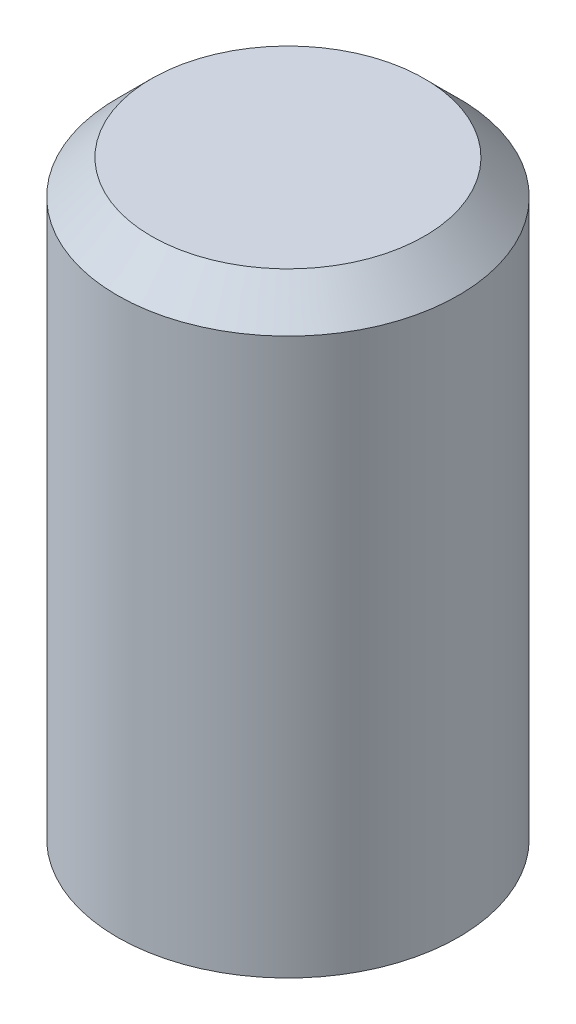
ISO-10303-21;
HEADER;
FILE_DESCRIPTION(('STEP AP214'),'2;1');
FILE_NAME('part.step','',(''),(''),'','','');
FILE_SCHEMA(('AUTOMOTIVE_DESIGN { 1 0 10303 214 1 1 1 1 }'));
ENDSEC;
DATA;
#1=APPLICATION_CONTEXT('core data for automotive mechanical design processes');
#2=APPLICATION_PROTOCOL_DEFINITION('international standard','automotive_design',2000,#1);
#3=PRODUCT_CONTEXT('',#1,'mechanical');
#4=PRODUCT('Part','Part','',(#3));
#5=PRODUCT_RELATED_PRODUCT_CATEGORY('part','',(#4));
#6=PRODUCT_DEFINITION_FORMATION('','',#4);
#7=PRODUCT_DEFINITION_CONTEXT('part definition',#1,'design');
#8=PRODUCT_DEFINITION('design','',#6,#7);
#9=PRODUCT_DEFINITION_SHAPE('','',#8);
#10=(LENGTH_UNIT() NAMED_UNIT(*) SI_UNIT(.MILLI.,.METRE.));
#11=(NAMED_UNIT(*) PLANE_ANGLE_UNIT() SI_UNIT($,.RADIAN.));
#12=(NAMED_UNIT(*) SI_UNIT($,.STERADIAN.) SOLID_ANGLE_UNIT());
#13=UNCERTAINTY_MEASURE_WITH_UNIT(LENGTH_MEASURE(1.E-05),#10,'distance_accuracy_value','');
#14=(GEOMETRIC_REPRESENTATION_CONTEXT(3) GLOBAL_UNCERTAINTY_ASSIGNED_CONTEXT((#13)) GLOBAL_UNIT_ASSIGNED_CONTEXT((#10,
#11,#12)) REPRESENTATION_CONTEXT('',''));
#15=CARTESIAN_POINT('',(0.,0.,0.));
#16=DIRECTION('',(0.,0.,1.));
#17=DIRECTION('',(1.,0.,0.));
#18=AXIS2_PLACEMENT_3D('',#15,#16,#17);
#19=CARTESIAN_POINT('',(0.,-70.,0.));
#20=DIRECTION('',(0.,1.,0.));
#21=DIRECTION('',(0.,0.,1.));
#22=AXIS2_PLACEMENT_3D('',#19,#20,#21);
#23=CYLINDRICAL_SURFACE('',#22,107.);
#24=CARTESIAN_POINT('',(0.,278.6,0.));
#25=DIRECTION('',(0.,1.,0.));
#26=DIRECTION('',(0.,0.,1.));
#27=AXIS2_PLACEMENT_3D('',#24,#25,#26);
#28=CIRCLE('',#27,107.);
#29=CARTESIAN_POINT('',(0.,278.6,107.));
#30=VERTEX_POINT('',#29);
#31=EDGE_CURVE('E10',#30,#30,#28,.F.);
#32=ORIENTED_EDGE('',*,*,#31,.T.);
#33=EDGE_LOOP('',(#32));
#34=FACE_BOUND('',#33,.T.);
#35=CARTESIAN_POINT('',(0.,-70.,0.));
#36=DIRECTION('',(0.,1.,0.));
#37=DIRECTION('',(0.,0.,1.));
#38=AXIS2_PLACEMENT_3D('',#35,#36,#37);
#39=CIRCLE('',#38,107.);
#40=CARTESIAN_POINT('',(0.,-70.,107.));
#41=VERTEX_POINT('',#40);
#42=EDGE_CURVE('E41',#41,#41,#39,.T.);
#43=ORIENTED_EDGE('',*,*,#42,.T.);
#44=EDGE_LOOP('',(#43));
#45=FACE_BOUND('',#44,.T.);
#46=ADVANCED_FACE('F30',(#34,#45),#23,.T.);
#47=CARTESIAN_POINT('',(0.,-70.,0.));
#48=DIRECTION('',(0.,1.,0.));
#49=DIRECTION('',(0.,0.,1.));
#50=AXIS2_PLACEMENT_3D('',#47,#48,#49);
#51=PLANE('',#50);
#52=ORIENTED_EDGE('',*,*,#42,.F.);
#53=EDGE_LOOP('',(#52));
#54=FACE_BOUND('',#53,.T.);
#55=ADVANCED_FACE('F49',(#54),#51,.F.);
#56=CARTESIAN_POINT('',(0.,300.,0.));
#57=DIRECTION('',(0.,1.,0.));
#58=DIRECTION('',(0.,0.,1.));
#59=AXIS2_PLACEMENT_3D('',#56,#57,#58);
#60=PLANE('',#59);
#61=CARTESIAN_POINT('',(0.,300.,0.));
#62=DIRECTION('',(0.,1.,0.));
#63=DIRECTION('',(0.,0.,1.));
#64=AXIS2_PLACEMENT_3D('',#61,#62,#63);
#65=CIRCLE('',#64,85.6);
#66=CARTESIAN_POINT('',(0.,300.,85.6));
#67=VERTEX_POINT('',#66);
#68=EDGE_CURVE('E37',#67,#67,#65,.T.);
#69=ORIENTED_EDGE('',*,*,#68,.T.);
#70=EDGE_LOOP('',(#69));
#71=FACE_BOUND('',#70,.T.);
#72=ADVANCED_FACE('F51',(#71),#60,.T.);
#73=CARTESIAN_POINT('',(0.,300.,0.));
#74=DIRECTION('',(0.,-1.,0.));
#75=DIRECTION('',(0.,0.,-1.));
#76=AXIS2_PLACEMENT_3D('',#73,#74,#75);
#77=CONICAL_SURFACE('',#76,85.6,0.785398163397446);
#78=ORIENTED_EDGE('',*,*,#31,.F.);
#79=EDGE_LOOP('',(#78));
#80=FACE_BOUND('',#79,.T.);
#81=ORIENTED_EDGE('',*,*,#68,.F.);
#82=EDGE_LOOP('',(#81));
#83=FACE_BOUND('',#82,.T.);
#84=ADVANCED_FACE('F32',(#80,#83),#77,.T.);
#85=CLOSED_SHELL('',(#46,#55,#72,#84));
#86=MANIFOLD_SOLID_BREP('B2',#85);
#87=ADVANCED_BREP_SHAPE_REPRESENTATION('',(#18,#86),#14);
#88=SHAPE_DEFINITION_REPRESENTATION(#9,#87);
ENDSEC;
END-ISO-10303-21;
